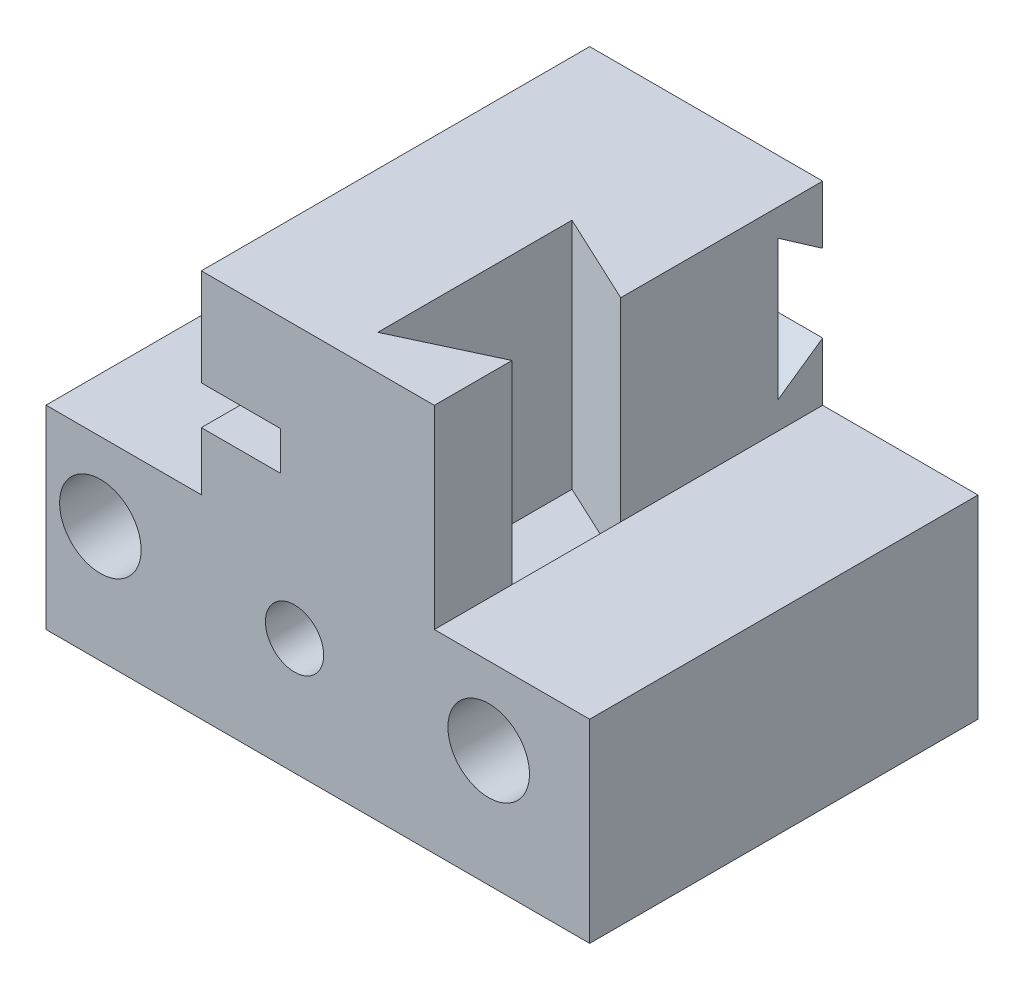
ISO-10303-21;
HEADER;
FILE_DESCRIPTION(('STEP AP214'),'2;1');
FILE_NAME('part.step','',(''),(''),'','','');
FILE_SCHEMA(('AUTOMOTIVE_DESIGN { 1 0 10303 214 1 1 1 1 }'));
ENDSEC;
DATA;
#1=APPLICATION_CONTEXT('core data for automotive mechanical design processes');
#2=APPLICATION_PROTOCOL_DEFINITION('international standard','automotive_design',2000,#1);
#3=PRODUCT_CONTEXT('',#1,'mechanical');
#4=PRODUCT('Part','Part','',(#3));
#5=PRODUCT_RELATED_PRODUCT_CATEGORY('part','',(#4));
#6=PRODUCT_DEFINITION_FORMATION('','',#4);
#7=PRODUCT_DEFINITION_CONTEXT('part definition',#1,'design');
#8=PRODUCT_DEFINITION('design','',#6,#7);
#9=PRODUCT_DEFINITION_SHAPE('','',#8);
#10=(LENGTH_UNIT() NAMED_UNIT(*) SI_UNIT(.MILLI.,.METRE.));
#11=(NAMED_UNIT(*) PLANE_ANGLE_UNIT() SI_UNIT($,.RADIAN.));
#12=(NAMED_UNIT(*) SI_UNIT($,.STERADIAN.) SOLID_ANGLE_UNIT());
#13=UNCERTAINTY_MEASURE_WITH_UNIT(LENGTH_MEASURE(1.E-05),#10,'distance_accuracy_value','');
#14=(GEOMETRIC_REPRESENTATION_CONTEXT(3) GLOBAL_UNCERTAINTY_ASSIGNED_CONTEXT((#13)) GLOBAL_UNIT_ASSIGNED_CONTEXT((#10,
#11,#12)) REPRESENTATION_CONTEXT('',''));
#15=CARTESIAN_POINT('',(0.,0.,0.));
#16=DIRECTION('',(0.,0.,1.));
#17=DIRECTION('',(1.,0.,0.));
#18=AXIS2_PLACEMENT_3D('',#15,#16,#17);
#19=CARTESIAN_POINT('',(2.,0.,0.));
#20=DIRECTION('',(1.,0.,0.));
#21=DIRECTION('',(0.,0.,-1.));
#22=AXIS2_PLACEMENT_3D('',#19,#20,#21);
#23=PLANE('',#22);
#24=DIRECTION('',(0.,1.,0.));
#25=VECTOR('',#24,1.);
#26=CARTESIAN_POINT('',(2.,4.0020682066455,5.));
#27=LINE('',#26,#25);
#28=CARTESIAN_POINT('',(2.,1.5020682066455,5.));
#29=VERTEX_POINT('',#28);
#30=CARTESIAN_POINT('',(2.,2.25126643414342,5.));
#31=VERTEX_POINT('',#30);
#32=EDGE_CURVE('E203',#29,#31,#27,.T.);
#33=ORIENTED_EDGE('',*,*,#32,.T.);
#34=DIRECTION('',(0.,0.,-1.));
#35=VECTOR('',#34,1.);
#36=CARTESIAN_POINT('',(2.,2.25126643414342,5.));
#37=LINE('',#36,#35);
#38=CARTESIAN_POINT('',(2.,2.25126643414342,0.574456264653803));
#39=VERTEX_POINT('',#38);
#40=EDGE_CURVE('E665',#31,#39,#37,.T.);
#41=ORIENTED_EDGE('',*,*,#40,.T.);
#42=DIRECTION('',(0.,1.,0.));
#43=VECTOR('',#42,1.);
#44=CARTESIAN_POINT('',(2.,1.85051975342205,0.574456264653803));
#45=LINE('',#44,#43);
#46=CARTESIAN_POINT('',(2.,1.85051975342205,0.574456264653803));
#47=VERTEX_POINT('',#46);
#48=EDGE_CURVE('E340',#47,#39,#45,.T.);
#49=ORIENTED_EDGE('',*,*,#48,.F.);
#50=DIRECTION('',(0.,-0.571428571428571,0.82065180664829));
#51=VECTOR('',#50,1.);
#52=CARTESIAN_POINT('',(2.,2.25051975342205,0.));
#53=LINE('',#52,#51);
#54=CARTESIAN_POINT('',(2.,2.25051975342205,0.));
#55=VERTEX_POINT('',#54);
#56=EDGE_CURVE('E400',#55,#47,#53,.T.);
#57=ORIENTED_EDGE('',*,*,#56,.F.);
#58=DIRECTION('',(0.,-1.,0.));
#59=VECTOR('',#58,1.);
#60=CARTESIAN_POINT('',(2.,4.0020682066455,0.));
#61=LINE('',#60,#59);
#62=CARTESIAN_POINT('',(2.,1.5020682066455,0.));
#63=VERTEX_POINT('',#62);
#64=EDGE_CURVE('E207',#55,#63,#61,.T.);
#65=ORIENTED_EDGE('',*,*,#64,.T.);
#66=DIRECTION('',(0.,0.,1.));
#67=VECTOR('',#66,1.);
#68=CARTESIAN_POINT('',(2.,1.5020682066455,5.));
#69=LINE('',#68,#67);
#70=EDGE_CURVE('E217',#63,#29,#69,.T.);
#71=ORIENTED_EDGE('',*,*,#70,.T.);
#72=EDGE_LOOP('',(#33,#41,#49,#57,#65,#71));
#73=FACE_BOUND('',#72,.T.);
#74=ADVANCED_FACE('F35',(#73),#23,.F.);
#75=CARTESIAN_POINT('',(7.,-1.,0.));
#76=DIRECTION('',(0.,0.,-1.));
#77=DIRECTION('',(-1.,0.,0.));
#78=AXIS2_PLACEMENT_3D('',#75,#76,#77);
#79=PLANE('',#78);
#80=DIRECTION('',(-1.,0.,0.));
#81=VECTOR('',#80,1.);
#82=CARTESIAN_POINT('',(7.,3.25051975342205,0.));
#83=LINE('',#82,#81);
#84=CARTESIAN_POINT('',(5.,3.25051975342205,0.));
#85=VERTEX_POINT('',#84);
#86=CARTESIAN_POINT('',(2.,3.25051975342205,0.));
#87=VERTEX_POINT('',#86);
#88=EDGE_CURVE('E335',#85,#87,#83,.T.);
#89=ORIENTED_EDGE('',*,*,#88,.T.);
#90=CARTESIAN_POINT('',(2.,4.,0.));
#91=VERTEX_POINT('',#90);
#92=EDGE_CURVE('E214',#91,#87,#61,.T.);
#93=ORIENTED_EDGE('',*,*,#92,.F.);
#94=DIRECTION('',(-1.,0.,0.));
#95=VECTOR('',#94,1.);
#96=CARTESIAN_POINT('',(7.,4.,0.));
#97=LINE('',#96,#95);
#98=CARTESIAN_POINT('',(5.,4.,0.));
#99=VERTEX_POINT('',#98);
#100=EDGE_CURVE('E280',#99,#91,#97,.T.);
#101=ORIENTED_EDGE('',*,*,#100,.F.);
#102=DIRECTION('',(0.,1.,0.));
#103=VECTOR('',#102,1.);
#104=CARTESIAN_POINT('',(5.,4.,0.));
#105=LINE('',#104,#103);
#106=EDGE_CURVE('E241',#85,#99,#105,.T.);
#107=ORIENTED_EDGE('',*,*,#106,.F.);
#108=EDGE_LOOP('',(#89,#93,#101,#107));
#109=FACE_BOUND('',#108,.T.);
#110=ADVANCED_FACE('F333',(#109),#79,.T.);
#111=CARTESIAN_POINT('',(5.,0.,0.));
#112=DIRECTION('',(1.,0.,0.));
#113=DIRECTION('',(0.,0.,-1.));
#114=AXIS2_PLACEMENT_3D('',#111,#112,#113);
#115=PLANE('',#114);
#116=DIRECTION('',(0.,-1.,0.));
#117=VECTOR('',#116,1.);
#118=CARTESIAN_POINT('',(5.,0.,4.));
#119=LINE('',#118,#117);
#120=CARTESIAN_POINT('',(5.,4.,4.));
#121=VERTEX_POINT('',#120);
#122=CARTESIAN_POINT('',(5.,1.5,4.));
#123=VERTEX_POINT('',#122);
#124=EDGE_CURVE('E11',#121,#123,#119,.T.);
#125=ORIENTED_EDGE('',*,*,#124,.F.);
#126=DIRECTION('',(0.,0.,1.));
#127=VECTOR('',#126,1.);
#128=CARTESIAN_POINT('',(5.,4.,5.));
#129=LINE('',#128,#127);
#130=CARTESIAN_POINT('',(5.,4.,5.));
#131=VERTEX_POINT('',#130);
#132=EDGE_CURVE('E246',#121,#131,#129,.T.);
#133=ORIENTED_EDGE('',*,*,#132,.T.);
#134=DIRECTION('',(0.,-1.,0.));
#135=VECTOR('',#134,1.);
#136=CARTESIAN_POINT('',(5.,4.,5.));
#137=LINE('',#136,#135);
#138=CARTESIAN_POINT('',(5.,1.5,5.));
#139=VERTEX_POINT('',#138);
#140=EDGE_CURVE('E234',#131,#139,#137,.T.);
#141=ORIENTED_EDGE('',*,*,#140,.T.);
#142=DIRECTION('',(0.,0.,-1.));
#143=VECTOR('',#142,1.);
#144=CARTESIAN_POINT('',(5.,1.5,5.));
#145=LINE('',#144,#143);
#146=EDGE_CURVE('E238',#139,#123,#145,.T.);
#147=ORIENTED_EDGE('',*,*,#146,.T.);
#148=EDGE_LOOP('',(#125,#133,#141,#147));
#149=FACE_BOUND('',#148,.T.);
#150=ADVANCED_FACE('F417',(#149),#115,.T.);
#151=CARTESIAN_POINT('',(0.,4.,0.));
#152=DIRECTION('',(0.,1.,0.));
#153=DIRECTION('',(0.,0.,1.));
#154=AXIS2_PLACEMENT_3D('',#151,#152,#153);
#155=PLANE('',#154);
#156=DIRECTION('',(0.906093768414596,0.,-0.423076923076923));
#157=VECTOR('',#156,1.);
#158=CARTESIAN_POINT('',(3.82207810106103,4.,4.55));
#159=LINE('',#158,#157);
#160=CARTESIAN_POINT('',(3.82207810106103,4.,4.55));
#161=VERTEX_POINT('',#160);
#162=EDGE_CURVE('E361',#161,#121,#159,.T.);
#163=ORIENTED_EDGE('',*,*,#162,.F.);
#164=DIRECTION('',(0.,0.,1.));
#165=VECTOR('',#164,1.);
#166=CARTESIAN_POINT('',(3.82207810106103,4.,2.05));
#167=LINE('',#166,#165);
#168=CARTESIAN_POINT('',(3.82207810106103,4.,2.05));
#169=VERTEX_POINT('',#168);
#170=EDGE_CURVE('E324',#169,#161,#167,.T.);
#171=ORIENTED_EDGE('',*,*,#170,.F.);
#172=DIRECTION('',(-0.906093768414596,0.,-0.423076923076923));
#173=VECTOR('',#172,1.);
#174=CARTESIAN_POINT('',(5.,4.,2.6));
#175=LINE('',#174,#173);
#176=CARTESIAN_POINT('',(5.,4.,2.6));
#177=VERTEX_POINT('',#176);
#178=EDGE_CURVE('E312',#177,#169,#175,.T.);
#179=ORIENTED_EDGE('',*,*,#178,.F.);
#180=EDGE_CURVE('E247',#99,#177,#129,.T.);
#181=ORIENTED_EDGE('',*,*,#180,.F.);
#182=ORIENTED_EDGE('',*,*,#100,.T.);
#183=DIRECTION('',(0.,0.,-1.));
#184=VECTOR('',#183,1.);
#185=CARTESIAN_POINT('',(2.,4.,0.));
#186=LINE('',#185,#184);
#187=CARTESIAN_POINT('',(2.,4.,5.));
#188=VERTEX_POINT('',#187);
#189=EDGE_CURVE('E224',#188,#91,#186,.T.);
#190=ORIENTED_EDGE('',*,*,#189,.F.);
#191=DIRECTION('',(1.,0.,0.));
#192=VECTOR('',#191,1.);
#193=CARTESIAN_POINT('',(0.,4.,5.));
#194=LINE('',#193,#192);
#195=EDGE_CURVE('E202',#188,#131,#194,.T.);
#196=ORIENTED_EDGE('',*,*,#195,.T.);
#197=ORIENTED_EDGE('',*,*,#132,.F.);
#198=EDGE_LOOP('',(#163,#171,#179,#181,#182,#190,#196,#197));
#199=FACE_BOUND('',#198,.T.);
#200=ADVANCED_FACE('F321',(#199),#155,.T.);
#201=DIRECTION('',(-1.,0.,0.));
#202=VECTOR('',#201,1.);
#203=CARTESIAN_POINT('',(7.,2.25051975342205,0.));
#204=LINE('',#203,#202);
#205=CARTESIAN_POINT('',(5.,2.25051975342205,0.));
#206=VERTEX_POINT('',#205);
#207=EDGE_CURVE('E58',#206,#55,#204,.T.);
#208=ORIENTED_EDGE('',*,*,#207,.F.);
#209=CARTESIAN_POINT('',(5.,1.5,0.));
#210=VERTEX_POINT('',#209);
#211=EDGE_CURVE('E243',#210,#206,#105,.T.);
#212=ORIENTED_EDGE('',*,*,#211,.F.);
#213=DIRECTION('',(1.,0.,0.));
#214=VECTOR('',#213,1.);
#215=CARTESIAN_POINT('',(5.,1.5,0.));
#216=LINE('',#215,#214);
#217=CARTESIAN_POINT('',(7.,1.5,0.));
#218=VERTEX_POINT('',#217);
#219=EDGE_CURVE('E252',#210,#218,#216,.T.);
#220=ORIENTED_EDGE('',*,*,#219,.T.);
#221=DIRECTION('',(0.,1.,0.));
#222=VECTOR('',#221,1.);
#223=CARTESIAN_POINT('',(7.,-1.,0.));
#224=LINE('',#223,#222);
#225=CARTESIAN_POINT('',(7.,-1.,0.));
#226=VERTEX_POINT('',#225);
#227=EDGE_CURVE('E297',#226,#218,#224,.T.);
#228=ORIENTED_EDGE('',*,*,#227,.F.);
#229=DIRECTION('',(-1.,0.,0.));
#230=VECTOR('',#229,1.);
#231=CARTESIAN_POINT('',(7.,-1.,0.));
#232=LINE('',#231,#230);
#233=CARTESIAN_POINT('',(0.,-1.,0.));
#234=VERTEX_POINT('',#233);
#235=EDGE_CURVE('E281',#226,#234,#232,.T.);
#236=ORIENTED_EDGE('',*,*,#235,.T.);
#237=DIRECTION('',(0.,1.,0.));
#238=VECTOR('',#237,1.);
#239=CARTESIAN_POINT('',(0.,-1.,0.));
#240=LINE('',#239,#238);
#241=CARTESIAN_POINT('',(0.,1.5020682066455,0.));
#242=VERTEX_POINT('',#241);
#243=EDGE_CURVE('E293',#234,#242,#240,.T.);
#244=ORIENTED_EDGE('',*,*,#243,.T.);
#245=DIRECTION('',(-1.,0.,0.));
#246=VECTOR('',#245,1.);
#247=CARTESIAN_POINT('',(2.,1.5020682066455,0.));
#248=LINE('',#247,#246);
#249=EDGE_CURVE('E219',#63,#242,#248,.T.);
#250=ORIENTED_EDGE('',*,*,#249,.F.);
#251=ORIENTED_EDGE('',*,*,#64,.F.);
#252=EDGE_LOOP('',(#208,#212,#220,#228,#236,#244,#250,#251));
#253=FACE_BOUND('',#252,.T.);
#254=CARTESIAN_POINT('',(3.2,0.5,0.));
#255=DIRECTION('',(0.,0.,-1.));
#256=DIRECTION('',(-1.,0.,0.));
#257=AXIS2_PLACEMENT_3D('',#254,#255,#256);
#258=CIRCLE('',#257,0.374999999999999);
#259=CARTESIAN_POINT('',(2.825,0.5,0.));
#260=VERTEX_POINT('',#259);
#261=EDGE_CURVE('E227',#260,#260,#258,.T.);
#262=ORIENTED_EDGE('',*,*,#261,.F.);
#263=EDGE_LOOP('',(#262));
#264=FACE_BOUND('',#263,.T.);
#265=CARTESIAN_POINT('',(5.7,0.499999999999999,0.));
#266=DIRECTION('',(0.,0.,-1.));
#267=DIRECTION('',(-1.,0.,0.));
#268=AXIS2_PLACEMENT_3D('',#265,#266,#267);
#269=CIRCLE('',#268,0.650000000000015);
#270=CARTESIAN_POINT('',(5.04999999999998,0.499999999999999,0.));
#271=VERTEX_POINT('',#270);
#272=EDGE_CURVE('E255',#271,#271,#269,.T.);
#273=ORIENTED_EDGE('',*,*,#272,.F.);
#274=EDGE_LOOP('',(#273));
#275=FACE_BOUND('',#274,.T.);
#276=CARTESIAN_POINT('',(0.7,0.5,0.));
#277=DIRECTION('',(0.,0.,-1.));
#278=DIRECTION('',(-1.,0.,0.));
#279=AXIS2_PLACEMENT_3D('',#276,#277,#278);
#280=CIRCLE('',#279,0.650000000000015);
#281=CARTESIAN_POINT('',(0.0499999999999852,0.5,0.));
#282=VERTEX_POINT('',#281);
#283=EDGE_CURVE('E268',#282,#282,#280,.T.);
#284=ORIENTED_EDGE('',*,*,#283,.F.);
#285=EDGE_LOOP('',(#284));
#286=FACE_BOUND('',#285,.T.);
#287=ADVANCED_FACE('F37',(#253,#264,#275,#286),#79,.T.);
#288=CARTESIAN_POINT('',(7.,-1.,5.));
#289=DIRECTION('',(1.,0.,0.));
#290=DIRECTION('',(0.,0.,-1.));
#291=AXIS2_PLACEMENT_3D('',#288,#289,#290);
#292=PLANE('',#291);
#293=DIRECTION('',(0.,0.,-1.));
#294=VECTOR('',#293,1.);
#295=CARTESIAN_POINT('',(7.,1.5,5.));
#296=LINE('',#295,#294);
#297=CARTESIAN_POINT('',(7.,1.5,5.));
#298=VERTEX_POINT('',#297);
#299=EDGE_CURVE('E233',#298,#218,#296,.T.);
#300=ORIENTED_EDGE('',*,*,#299,.F.);
#301=DIRECTION('',(0.,1.,0.));
#302=VECTOR('',#301,1.);
#303=CARTESIAN_POINT('',(7.,-1.,5.));
#304=LINE('',#303,#302);
#305=CARTESIAN_POINT('',(7.,-1.,5.));
#306=VERTEX_POINT('',#305);
#307=EDGE_CURVE('E300',#306,#298,#304,.T.);
#308=ORIENTED_EDGE('',*,*,#307,.F.);
#309=DIRECTION('',(0.,0.,-1.));
#310=VECTOR('',#309,1.);
#311=CARTESIAN_POINT('',(7.,-1.,5.));
#312=LINE('',#311,#310);
#313=EDGE_CURVE('E290',#306,#226,#312,.T.);
#314=ORIENTED_EDGE('',*,*,#313,.T.);
#315=ORIENTED_EDGE('',*,*,#227,.T.);
#316=EDGE_LOOP('',(#300,#308,#314,#315));
#317=FACE_BOUND('',#316,.T.);
#318=ADVANCED_FACE('F413',(#317),#292,.T.);
#319=CARTESIAN_POINT('',(0.,-1.,5.));
#320=DIRECTION('',(0.,0.,1.));
#321=DIRECTION('',(1.,0.,0.));
#322=AXIS2_PLACEMENT_3D('',#319,#320,#321);
#323=PLANE('',#322);
#324=DIRECTION('',(-1.,0.,0.));
#325=VECTOR('',#324,1.);
#326=CARTESIAN_POINT('',(2.,2.25126643414342,5.));
#327=LINE('',#326,#325);
#328=CARTESIAN_POINT('',(3.02036879201495,2.25126643414342,5.));
#329=VERTEX_POINT('',#328);
#330=EDGE_CURVE('E194',#329,#31,#327,.T.);
#331=ORIENTED_EDGE('',*,*,#330,.T.);
#332=ORIENTED_EDGE('',*,*,#32,.F.);
#333=DIRECTION('',(-1.,0.,0.));
#334=VECTOR('',#333,1.);
#335=CARTESIAN_POINT('',(2.,1.5020682066455,5.));
#336=LINE('',#335,#334);
#337=CARTESIAN_POINT('',(0.,1.5020682066455,5.));
#338=VERTEX_POINT('',#337);
#339=EDGE_CURVE('E221',#29,#338,#336,.T.);
#340=ORIENTED_EDGE('',*,*,#339,.T.);
#341=DIRECTION('',(0.,1.,0.));
#342=VECTOR('',#341,1.);
#343=CARTESIAN_POINT('',(0.,-1.,5.));
#344=LINE('',#343,#342);
#345=CARTESIAN_POINT('',(0.,-1.,5.));
#346=VERTEX_POINT('',#345);
#347=EDGE_CURVE('E303',#346,#338,#344,.T.);
#348=ORIENTED_EDGE('',*,*,#347,.F.);
#349=DIRECTION('',(1.,0.,0.));
#350=VECTOR('',#349,1.);
#351=CARTESIAN_POINT('',(0.,-1.,5.));
#352=LINE('',#351,#350);
#353=EDGE_CURVE('E287',#346,#306,#352,.T.);
#354=ORIENTED_EDGE('',*,*,#353,.T.);
#355=ORIENTED_EDGE('',*,*,#307,.T.);
#356=DIRECTION('',(1.,0.,0.));
#357=VECTOR('',#356,1.);
#358=CARTESIAN_POINT('',(5.,1.5,5.));
#359=LINE('',#358,#357);
#360=EDGE_CURVE('E250',#139,#298,#359,.T.);
#361=ORIENTED_EDGE('',*,*,#360,.F.);
#362=ORIENTED_EDGE('',*,*,#140,.F.);
#363=ORIENTED_EDGE('',*,*,#195,.F.);
#364=CARTESIAN_POINT('',(2.,2.75051975342205,5.));
#365=VERTEX_POINT('',#364);
#366=EDGE_CURVE('E190',#365,#188,#27,.T.);
#367=ORIENTED_EDGE('',*,*,#366,.F.);
#368=DIRECTION('',(1.,0.,0.));
#369=VECTOR('',#368,1.);
#370=CARTESIAN_POINT('',(2.,2.75051975342205,5.));
#371=LINE('',#370,#369);
#372=CARTESIAN_POINT('',(3.02036879201495,2.75051975342205,5.));
#373=VERTEX_POINT('',#372);
#374=EDGE_CURVE('E177',#365,#373,#371,.T.);
#375=ORIENTED_EDGE('',*,*,#374,.T.);
#376=DIRECTION('',(0.,-1.,0.));
#377=VECTOR('',#376,1.);
#378=CARTESIAN_POINT('',(3.02036879201495,2.25126643414342,5.));
#379=LINE('',#378,#377);
#380=EDGE_CURVE('E184',#373,#329,#379,.T.);
#381=ORIENTED_EDGE('',*,*,#380,.T.);
#382=EDGE_LOOP('',(#331,#332,#340,#348,#354,#355,#361,#362,#363,#367,#375,#381));
#383=FACE_BOUND('',#382,.T.);
#384=CARTESIAN_POINT('',(3.2,0.5,5.));
#385=DIRECTION('',(0.,0.,1.));
#386=DIRECTION('',(1.,0.,0.));
#387=AXIS2_PLACEMENT_3D('',#384,#385,#386);
#388=CIRCLE('',#387,0.374999999999999);
#389=CARTESIAN_POINT('',(3.575,0.5,5.));
#390=VERTEX_POINT('',#389);
#391=EDGE_CURVE('E230',#390,#390,#388,.T.);
#392=ORIENTED_EDGE('',*,*,#391,.F.);
#393=EDGE_LOOP('',(#392));
#394=FACE_BOUND('',#393,.T.);
#395=CARTESIAN_POINT('',(5.7,0.499999999999999,5.));
#396=DIRECTION('',(0.,0.,-1.));
#397=DIRECTION('',(-1.,0.,0.));
#398=AXIS2_PLACEMENT_3D('',#395,#396,#397);
#399=CIRCLE('',#398,0.525000000000013);
#400=CARTESIAN_POINT('',(5.17499999999999,0.499999999999999,5.));
#401=VERTEX_POINT('',#400);
#402=EDGE_CURVE('E265',#401,#401,#399,.T.);
#403=ORIENTED_EDGE('',*,*,#402,.T.);
#404=EDGE_LOOP('',(#403));
#405=FACE_BOUND('',#404,.T.);
#406=CARTESIAN_POINT('',(0.7,0.5,5.));
#407=DIRECTION('',(0.,0.,-1.));
#408=DIRECTION('',(-1.,0.,0.));
#409=AXIS2_PLACEMENT_3D('',#406,#407,#408);
#410=CIRCLE('',#409,0.525000000000013);
#411=CARTESIAN_POINT('',(0.174999999999987,0.5,5.));
#412=VERTEX_POINT('',#411);
#413=EDGE_CURVE('E277',#412,#412,#410,.T.);
#414=ORIENTED_EDGE('',*,*,#413,.T.);
#415=EDGE_LOOP('',(#414));
#416=FACE_BOUND('',#415,.T.);
#417=ADVANCED_FACE('F198',(#383,#394,#405,#416),#323,.T.);
#418=CARTESIAN_POINT('',(0.,-1.,0.));
#419=DIRECTION('',(-1.,0.,0.));
#420=DIRECTION('',(0.,0.,1.));
#421=AXIS2_PLACEMENT_3D('',#418,#419,#420);
#422=PLANE('',#421);
#423=DIRECTION('',(0.,0.,1.));
#424=VECTOR('',#423,1.);
#425=CARTESIAN_POINT('',(0.,1.5020682066455,5.));
#426=LINE('',#425,#424);
#427=EDGE_CURVE('E204',#242,#338,#426,.T.);
#428=ORIENTED_EDGE('',*,*,#427,.F.);
#429=ORIENTED_EDGE('',*,*,#243,.F.);
#430=DIRECTION('',(0.,0.,1.));
#431=VECTOR('',#430,1.);
#432=CARTESIAN_POINT('',(0.,-1.,0.));
#433=LINE('',#432,#431);
#434=EDGE_CURVE('E284',#234,#346,#433,.T.);
#435=ORIENTED_EDGE('',*,*,#434,.T.);
#436=ORIENTED_EDGE('',*,*,#347,.T.);
#437=EDGE_LOOP('',(#428,#429,#435,#436));
#438=FACE_BOUND('',#437,.T.);
#439=ADVANCED_FACE('F406',(#438),#422,.T.);
#440=CARTESIAN_POINT('',(0.,-1.,0.));
#441=DIRECTION('',(0.,1.,0.));
#442=DIRECTION('',(0.,0.,1.));
#443=AXIS2_PLACEMENT_3D('',#440,#441,#442);
#444=PLANE('',#443);
#445=ORIENTED_EDGE('',*,*,#235,.F.);
#446=ORIENTED_EDGE('',*,*,#313,.F.);
#447=ORIENTED_EDGE('',*,*,#353,.F.);
#448=ORIENTED_EDGE('',*,*,#434,.F.);
#449=EDGE_LOOP('',(#445,#446,#447,#448));
#450=FACE_BOUND('',#449,.T.);
#451=ADVANCED_FACE('F410',(#450),#444,.F.);
#452=CARTESIAN_POINT('',(0.7,0.5,0.));
#453=DIRECTION('',(0.,0.,-1.));
#454=DIRECTION('',(-1.,0.,0.));
#455=AXIS2_PLACEMENT_3D('',#452,#453,#454);
#456=CYLINDRICAL_SURFACE('',#455,0.525000000000013);
#457=ORIENTED_EDGE('',*,*,#413,.F.);
#458=EDGE_LOOP('',(#457));
#459=FACE_BOUND('',#458,.T.);
#460=CARTESIAN_POINT('',(0.7,0.5,1.2));
#461=DIRECTION('',(0.,0.,-1.));
#462=DIRECTION('',(-1.,0.,0.));
#463=AXIS2_PLACEMENT_3D('',#460,#461,#462);
#464=CIRCLE('',#463,0.525000000000013);
#465=CARTESIAN_POINT('',(0.174999999999987,0.5,1.2));
#466=VERTEX_POINT('',#465);
#467=EDGE_CURVE('E274',#466,#466,#464,.T.);
#468=ORIENTED_EDGE('',*,*,#467,.T.);
#469=EDGE_LOOP('',(#468));
#470=FACE_BOUND('',#469,.T.);
#471=ADVANCED_FACE('F469',(#459,#470),#456,.F.);
#472=CARTESIAN_POINT('',(1.22500000000001,0.5,1.2));
#473=DIRECTION('',(0.,0.,1.));
#474=DIRECTION('',(1.,0.,0.));
#475=AXIS2_PLACEMENT_3D('',#472,#473,#474);
#476=PLANE('',#475);
#477=ORIENTED_EDGE('',*,*,#467,.F.);
#478=EDGE_LOOP('',(#477));
#479=FACE_BOUND('',#478,.T.);
#480=CARTESIAN_POINT('',(0.7,0.5,1.2));
#481=DIRECTION('',(0.,0.,-1.));
#482=DIRECTION('',(-1.,0.,0.));
#483=AXIS2_PLACEMENT_3D('',#480,#481,#482);
#484=CIRCLE('',#483,0.650000000000015);
#485=CARTESIAN_POINT('',(0.0499999999999852,0.5,1.2));
#486=VERTEX_POINT('',#485);
#487=EDGE_CURVE('E271',#486,#486,#484,.T.);
#488=ORIENTED_EDGE('',*,*,#487,.T.);
#489=EDGE_LOOP('',(#488));
#490=FACE_BOUND('',#489,.T.);
#491=ADVANCED_FACE('F465',(#479,#490),#476,.F.);
#492=CARTESIAN_POINT('',(0.7,0.5,0.));
#493=DIRECTION('',(0.,0.,-1.));
#494=DIRECTION('',(-1.,0.,0.));
#495=AXIS2_PLACEMENT_3D('',#492,#493,#494);
#496=CYLINDRICAL_SURFACE('',#495,0.650000000000015);
#497=ORIENTED_EDGE('',*,*,#487,.F.);
#498=EDGE_LOOP('',(#497));
#499=FACE_BOUND('',#498,.T.);
#500=ORIENTED_EDGE('',*,*,#283,.T.);
#501=EDGE_LOOP('',(#500));
#502=FACE_BOUND('',#501,.T.);
#503=ADVANCED_FACE('F461',(#499,#502),#496,.F.);
#504=CARTESIAN_POINT('',(5.7,0.499999999999999,0.));
#505=DIRECTION('',(0.,0.,-1.));
#506=DIRECTION('',(-1.,0.,0.));
#507=AXIS2_PLACEMENT_3D('',#504,#505,#506);
#508=CYLINDRICAL_SURFACE('',#507,0.525000000000013);
#509=ORIENTED_EDGE('',*,*,#402,.F.);
#510=EDGE_LOOP('',(#509));
#511=FACE_BOUND('',#510,.T.);
#512=CARTESIAN_POINT('',(5.7,0.499999999999999,1.2));
#513=DIRECTION('',(0.,0.,-1.));
#514=DIRECTION('',(-1.,0.,0.));
#515=AXIS2_PLACEMENT_3D('',#512,#513,#514);
#516=CIRCLE('',#515,0.525000000000013);
#517=CARTESIAN_POINT('',(5.17499999999999,0.499999999999999,1.2));
#518=VERTEX_POINT('',#517);
#519=EDGE_CURVE('E262',#518,#518,#516,.T.);
#520=ORIENTED_EDGE('',*,*,#519,.T.);
#521=EDGE_LOOP('',(#520));
#522=FACE_BOUND('',#521,.T.);
#523=ADVANCED_FACE('F457',(#511,#522),#508,.F.);
#524=CARTESIAN_POINT('',(6.22500000000001,0.499999999999999,1.2));
#525=DIRECTION('',(0.,0.,1.));
#526=DIRECTION('',(1.,0.,0.));
#527=AXIS2_PLACEMENT_3D('',#524,#525,#526);
#528=PLANE('',#527);
#529=ORIENTED_EDGE('',*,*,#519,.F.);
#530=EDGE_LOOP('',(#529));
#531=FACE_BOUND('',#530,.T.);
#532=CARTESIAN_POINT('',(5.7,0.499999999999999,1.2));
#533=DIRECTION('',(0.,0.,-1.));
#534=DIRECTION('',(-1.,0.,0.));
#535=AXIS2_PLACEMENT_3D('',#532,#533,#534);
#536=CIRCLE('',#535,0.650000000000015);
#537=CARTESIAN_POINT('',(5.04999999999998,0.499999999999999,1.2));
#538=VERTEX_POINT('',#537);
#539=EDGE_CURVE('E259',#538,#538,#536,.T.);
#540=ORIENTED_EDGE('',*,*,#539,.T.);
#541=EDGE_LOOP('',(#540));
#542=FACE_BOUND('',#541,.T.);
#543=ADVANCED_FACE('F453',(#531,#542),#528,.F.);
#544=CARTESIAN_POINT('',(5.7,0.499999999999999,0.));
#545=DIRECTION('',(0.,0.,-1.));
#546=DIRECTION('',(-1.,0.,0.));
#547=AXIS2_PLACEMENT_3D('',#544,#545,#546);
#548=CYLINDRICAL_SURFACE('',#547,0.650000000000015);
#549=ORIENTED_EDGE('',*,*,#539,.F.);
#550=EDGE_LOOP('',(#549));
#551=FACE_BOUND('',#550,.T.);
#552=ORIENTED_EDGE('',*,*,#272,.T.);
#553=EDGE_LOOP('',(#552));
#554=FACE_BOUND('',#553,.T.);
#555=ADVANCED_FACE('F450',(#551,#554),#548,.F.);
#556=CARTESIAN_POINT('',(5.,1.5,5.));
#557=DIRECTION('',(0.,-1.,0.));
#558=DIRECTION('',(0.,0.,-1.));
#559=AXIS2_PLACEMENT_3D('',#556,#557,#558);
#560=PLANE('',#559);
#561=ORIENTED_EDGE('',*,*,#299,.T.);
#562=ORIENTED_EDGE('',*,*,#219,.F.);
#563=CARTESIAN_POINT('',(5.,1.5,2.6));
#564=VERTEX_POINT('',#563);
#565=EDGE_CURVE('E237',#564,#210,#145,.T.);
#566=ORIENTED_EDGE('',*,*,#565,.F.);
#567=EDGE_CURVE('E242',#123,#564,#145,.T.);
#568=ORIENTED_EDGE('',*,*,#567,.F.);
#569=ORIENTED_EDGE('',*,*,#146,.F.);
#570=ORIENTED_EDGE('',*,*,#360,.T.);
#571=EDGE_LOOP('',(#561,#562,#566,#568,#569,#570));
#572=FACE_BOUND('',#571,.T.);
#573=ADVANCED_FACE('F390',(#572),#560,.F.);
#574=DIRECTION('',(0.,0.571428571428572,0.82065180664829));
#575=VECTOR('',#574,1.);
#576=CARTESIAN_POINT('',(5.,2.18912554822302,-1.52431137610958));
#577=LINE('',#576,#575);
#578=CARTESIAN_POINT('',(5.,3.65051975342205,0.574456264653803));
#579=VERTEX_POINT('',#578);
#580=EDGE_CURVE('E325',#85,#579,#577,.T.);
#581=ORIENTED_EDGE('',*,*,#580,.F.);
#582=ORIENTED_EDGE('',*,*,#106,.T.);
#583=ORIENTED_EDGE('',*,*,#180,.T.);
#584=DIRECTION('',(0.,1.,0.));
#585=VECTOR('',#584,1.);
#586=CARTESIAN_POINT('',(5.,0.,2.6));
#587=LINE('',#586,#585);
#588=EDGE_CURVE('E43',#564,#177,#587,.T.);
#589=ORIENTED_EDGE('',*,*,#588,.F.);
#590=ORIENTED_EDGE('',*,*,#565,.T.);
#591=ORIENTED_EDGE('',*,*,#211,.T.);
#592=DIRECTION('',(0.,0.571428571428571,-0.82065180664829));
#593=VECTOR('',#592,1.);
#594=CARTESIAN_POINT('',(5.,1.51565616046791,1.05536748659627));
#595=LINE('',#594,#593);
#596=CARTESIAN_POINT('',(5.,1.85051975342205,0.574456264653803));
#597=VERTEX_POINT('',#596);
#598=EDGE_CURVE('E349',#597,#206,#595,.T.);
#599=ORIENTED_EDGE('',*,*,#598,.F.);
#600=DIRECTION('',(0.,-1.,0.));
#601=VECTOR('',#600,1.);
#602=CARTESIAN_POINT('',(5.,0.,0.574456264653803));
#603=LINE('',#602,#601);
#604=EDGE_CURVE('E354',#579,#597,#603,.T.);
#605=ORIENTED_EDGE('',*,*,#604,.F.);
#606=EDGE_LOOP('',(#581,#582,#583,#589,#590,#591,#599,#605));
#607=FACE_BOUND('',#606,.T.);
#608=ADVANCED_FACE('F328',(#607),#115,.T.);
#609=CARTESIAN_POINT('',(3.2,0.5,0.));
#610=DIRECTION('',(0.,0.,-1.));
#611=DIRECTION('',(-1.,0.,0.));
#612=AXIS2_PLACEMENT_3D('',#609,#610,#611);
#613=CYLINDRICAL_SURFACE('',#612,0.374999999999999);
#614=ORIENTED_EDGE('',*,*,#261,.T.);
#615=EDGE_LOOP('',(#614));
#616=FACE_BOUND('',#615,.T.);
#617=ORIENTED_EDGE('',*,*,#391,.T.);
#618=EDGE_LOOP('',(#617));
#619=FACE_BOUND('',#618,.T.);
#620=ADVANCED_FACE('F439',(#616,#619),#613,.F.);
#621=CARTESIAN_POINT('',(2.,1.5020682066455,5.));
#622=DIRECTION('',(0.,-1.,0.));
#623=DIRECTION('',(0.,0.,-1.));
#624=AXIS2_PLACEMENT_3D('',#621,#622,#623);
#625=PLANE('',#624);
#626=ORIENTED_EDGE('',*,*,#427,.T.);
#627=ORIENTED_EDGE('',*,*,#339,.F.);
#628=ORIENTED_EDGE('',*,*,#70,.F.);
#629=ORIENTED_EDGE('',*,*,#249,.T.);
#630=EDGE_LOOP('',(#626,#627,#628,#629));
#631=FACE_BOUND('',#630,.T.);
#632=ADVANCED_FACE('F402',(#631),#625,.F.);
#633=CARTESIAN_POINT('',(2.,2.75051975342205,0.574456264653803));
#634=VERTEX_POINT('',#633);
#635=CARTESIAN_POINT('',(2.,3.65051975342205,0.574456264653803));
#636=VERTEX_POINT('',#635);
#637=EDGE_CURVE('E193',#634,#636,#45,.T.);
#638=ORIENTED_EDGE('',*,*,#637,.F.);
#639=DIRECTION('',(0.,0.,-1.));
#640=VECTOR('',#639,1.);
#641=CARTESIAN_POINT('',(2.,2.75051975342205,5.));
#642=LINE('',#641,#640);
#643=EDGE_CURVE('E50',#365,#634,#642,.T.);
#644=ORIENTED_EDGE('',*,*,#643,.F.);
#645=ORIENTED_EDGE('',*,*,#366,.T.);
#646=ORIENTED_EDGE('',*,*,#189,.T.);
#647=ORIENTED_EDGE('',*,*,#92,.T.);
#648=DIRECTION('',(0.,-0.571428571428572,-0.82065180664829));
#649=VECTOR('',#648,1.);
#650=CARTESIAN_POINT('',(2.,3.65051975342205,0.574456264653803));
#651=LINE('',#650,#649);
#652=EDGE_CURVE('E337',#636,#87,#651,.T.);
#653=ORIENTED_EDGE('',*,*,#652,.F.);
#654=EDGE_LOOP('',(#638,#644,#645,#646,#647,#653));
#655=FACE_BOUND('',#654,.T.);
#656=ADVANCED_FACE('F189',(#655),#23,.F.);
#657=CARTESIAN_POINT('',(5.,1.,4.));
#658=DIRECTION('',(1.,0.,0.));
#659=DIRECTION('',(0.,0.,-1.));
#660=AXIS2_PLACEMENT_3D('',#657,#658,#659);
#661=PLANE('',#660);
#662=DIRECTION('',(0.,1.,0.));
#663=VECTOR('',#662,1.);
#664=CARTESIAN_POINT('',(5.,1.,2.6));
#665=LINE('',#664,#663);
#666=CARTESIAN_POINT('',(5.,1.,2.6));
#667=VERTEX_POINT('',#666);
#668=EDGE_CURVE('E212',#667,#564,#665,.T.);
#669=ORIENTED_EDGE('',*,*,#668,.F.);
#670=DIRECTION('',(0.,0.,-1.));
#671=VECTOR('',#670,1.);
#672=CARTESIAN_POINT('',(5.,1.,4.));
#673=LINE('',#672,#671);
#674=CARTESIAN_POINT('',(5.,1.,4.));
#675=VERTEX_POINT('',#674);
#676=EDGE_CURVE('E357',#675,#667,#673,.T.);
#677=ORIENTED_EDGE('',*,*,#676,.F.);
#678=DIRECTION('',(0.,1.,0.));
#679=VECTOR('',#678,1.);
#680=CARTESIAN_POINT('',(5.,1.,4.));
#681=LINE('',#680,#679);
#682=EDGE_CURVE('E208',#675,#123,#681,.T.);
#683=ORIENTED_EDGE('',*,*,#682,.T.);
#684=ORIENTED_EDGE('',*,*,#567,.T.);
#685=EDGE_LOOP('',(#669,#677,#683,#684));
#686=FACE_BOUND('',#685,.T.);
#687=ADVANCED_FACE('F384',(#686),#661,.F.);
#688=CARTESIAN_POINT('',(3.82207810106103,1.,4.55));
#689=DIRECTION('',(0.423076923076923,0.,0.906093768414596));
#690=DIRECTION('',(0.906093768414596,0.,-0.423076923076923));
#691=AXIS2_PLACEMENT_3D('',#688,#689,#690);
#692=PLANE('',#691);
#693=ORIENTED_EDGE('',*,*,#162,.T.);
#694=ORIENTED_EDGE('',*,*,#124,.T.);
#695=ORIENTED_EDGE('',*,*,#682,.F.);
#696=DIRECTION('',(0.906093768414596,0.,-0.423076923076923));
#697=VECTOR('',#696,1.);
#698=CARTESIAN_POINT('',(3.82207810106103,1.,4.55));
#699=LINE('',#698,#697);
#700=CARTESIAN_POINT('',(3.82207810106103,1.,4.55));
#701=VERTEX_POINT('',#700);
#702=EDGE_CURVE('E367',#701,#675,#699,.T.);
#703=ORIENTED_EDGE('',*,*,#702,.F.);
#704=DIRECTION('',(0.,1.,0.));
#705=VECTOR('',#704,1.);
#706=CARTESIAN_POINT('',(3.82207810106103,1.,4.55));
#707=LINE('',#706,#705);
#708=EDGE_CURVE('E374',#701,#161,#707,.T.);
#709=ORIENTED_EDGE('',*,*,#708,.T.);
#710=EDGE_LOOP('',(#693,#694,#695,#703,#709));
#711=FACE_BOUND('',#710,.T.);
#712=ADVANCED_FACE('F419',(#711),#692,.F.);
#713=CARTESIAN_POINT('',(3.82207810106103,1.,2.05));
#714=DIRECTION('',(-1.,0.,0.));
#715=DIRECTION('',(0.,0.,1.));
#716=AXIS2_PLACEMENT_3D('',#713,#714,#715);
#717=PLANE('',#716);
#718=ORIENTED_EDGE('',*,*,#170,.T.);
#719=ORIENTED_EDGE('',*,*,#708,.F.);
#720=DIRECTION('',(0.,0.,1.));
#721=VECTOR('',#720,1.);
#722=CARTESIAN_POINT('',(3.82207810106103,1.,2.05));
#723=LINE('',#722,#721);
#724=CARTESIAN_POINT('',(3.82207810106103,1.,2.05));
#725=VERTEX_POINT('',#724);
#726=EDGE_CURVE('E364',#725,#701,#723,.T.);
#727=ORIENTED_EDGE('',*,*,#726,.F.);
#728=DIRECTION('',(0.,1.,0.));
#729=VECTOR('',#728,1.);
#730=CARTESIAN_POINT('',(3.82207810106103,1.,2.05));
#731=LINE('',#730,#729);
#732=EDGE_CURVE('E375',#725,#169,#731,.T.);
#733=ORIENTED_EDGE('',*,*,#732,.T.);
#734=EDGE_LOOP('',(#718,#719,#727,#733));
#735=FACE_BOUND('',#734,.T.);
#736=ADVANCED_FACE('F378',(#735),#717,.F.);
#737=CARTESIAN_POINT('',(5.,1.,2.6));
#738=DIRECTION('',(0.423076923076923,0.,-0.906093768414596));
#739=DIRECTION('',(-0.906093768414596,0.,-0.423076923076923));
#740=AXIS2_PLACEMENT_3D('',#737,#738,#739);
#741=PLANE('',#740);
#742=ORIENTED_EDGE('',*,*,#178,.T.);
#743=ORIENTED_EDGE('',*,*,#732,.F.);
#744=DIRECTION('',(-0.906093768414596,0.,-0.423076923076923));
#745=VECTOR('',#744,1.);
#746=CARTESIAN_POINT('',(5.,1.,2.6));
#747=LINE('',#746,#745);
#748=EDGE_CURVE('E360',#667,#725,#747,.T.);
#749=ORIENTED_EDGE('',*,*,#748,.F.);
#750=ORIENTED_EDGE('',*,*,#668,.T.);
#751=ORIENTED_EDGE('',*,*,#588,.T.);
#752=EDGE_LOOP('',(#742,#743,#749,#750,#751));
#753=FACE_BOUND('',#752,.T.);
#754=ADVANCED_FACE('F311',(#753),#741,.F.);
#755=CARTESIAN_POINT('',(0.,1.,0.));
#756=DIRECTION('',(0.,1.,0.));
#757=DIRECTION('',(0.,0.,1.));
#758=AXIS2_PLACEMENT_3D('',#755,#756,#757);
#759=PLANE('',#758);
#760=ORIENTED_EDGE('',*,*,#676,.T.);
#761=ORIENTED_EDGE('',*,*,#748,.T.);
#762=ORIENTED_EDGE('',*,*,#726,.T.);
#763=ORIENTED_EDGE('',*,*,#702,.T.);
#764=EDGE_LOOP('',(#760,#761,#762,#763));
#765=FACE_BOUND('',#764,.T.);
#766=ADVANCED_FACE('F381',(#765),#759,.T.);
#767=CARTESIAN_POINT('',(7.,3.65051975342205,0.574456264653803));
#768=DIRECTION('',(0.,0.82065180664829,-0.571428571428572));
#769=DIRECTION('',(0.,0.571428571428572,0.82065180664829));
#770=AXIS2_PLACEMENT_3D('',#767,#768,#769);
#771=PLANE('',#770);
#772=ORIENTED_EDGE('',*,*,#580,.T.);
#773=DIRECTION('',(-1.,0.,0.));
#774=VECTOR('',#773,1.);
#775=CARTESIAN_POINT('',(7.,3.65051975342205,0.574456264653803));
#776=LINE('',#775,#774);
#777=EDGE_CURVE('E350',#579,#636,#776,.T.);
#778=ORIENTED_EDGE('',*,*,#777,.T.);
#779=ORIENTED_EDGE('',*,*,#652,.T.);
#780=ORIENTED_EDGE('',*,*,#88,.F.);
#781=EDGE_LOOP('',(#772,#778,#779,#780));
#782=FACE_BOUND('',#781,.T.);
#783=ADVANCED_FACE('F578',(#782),#771,.F.);
#784=CARTESIAN_POINT('',(7.,1.85051975342205,0.574456264653803));
#785=DIRECTION('',(0.,0.,1.));
#786=DIRECTION('',(0.,-1.,0.));
#787=AXIS2_PLACEMENT_3D('',#784,#785,#786);
#788=PLANE('',#787);
#789=ORIENTED_EDGE('',*,*,#48,.T.);
#790=DIRECTION('',(-1.,0.,0.));
#791=VECTOR('',#790,1.);
#792=CARTESIAN_POINT('',(2.,2.25126643414342,0.574456264653803));
#793=LINE('',#792,#791);
#794=CARTESIAN_POINT('',(3.02036879201495,2.25126643414342,0.574456264653803));
#795=VERTEX_POINT('',#794);
#796=EDGE_CURVE('E185',#795,#39,#793,.T.);
#797=ORIENTED_EDGE('',*,*,#796,.F.);
#798=DIRECTION('',(0.,-1.,0.));
#799=VECTOR('',#798,1.);
#800=CARTESIAN_POINT('',(3.02036879201495,2.25126643414342,0.574456264653803));
#801=LINE('',#800,#799);
#802=CARTESIAN_POINT('',(3.02036879201495,2.75051975342205,0.574456264653803));
#803=VERTEX_POINT('',#802);
#804=EDGE_CURVE('E673',#803,#795,#801,.T.);
#805=ORIENTED_EDGE('',*,*,#804,.F.);
#806=DIRECTION('',(1.,0.,0.));
#807=VECTOR('',#806,1.);
#808=CARTESIAN_POINT('',(2.,2.75051975342205,0.574456264653803));
#809=LINE('',#808,#807);
#810=EDGE_CURVE('E664',#634,#803,#809,.T.);
#811=ORIENTED_EDGE('',*,*,#810,.F.);
#812=ORIENTED_EDGE('',*,*,#637,.T.);
#813=ORIENTED_EDGE('',*,*,#777,.F.);
#814=ORIENTED_EDGE('',*,*,#604,.T.);
#815=DIRECTION('',(-1.,0.,0.));
#816=VECTOR('',#815,1.);
#817=CARTESIAN_POINT('',(7.,1.85051975342205,0.574456264653803));
#818=LINE('',#817,#816);
#819=EDGE_CURVE('E342',#597,#47,#818,.T.);
#820=ORIENTED_EDGE('',*,*,#819,.T.);
#821=EDGE_LOOP('',(#789,#797,#805,#811,#812,#813,#814,#820));
#822=FACE_BOUND('',#821,.T.);
#823=ADVANCED_FACE('F616',(#822),#788,.F.);
#824=CARTESIAN_POINT('',(7.,2.25051975342205,0.));
#825=DIRECTION('',(0.,-0.82065180664829,-0.571428571428571));
#826=DIRECTION('',(0.,0.571428571428571,-0.82065180664829));
#827=AXIS2_PLACEMENT_3D('',#824,#825,#826);
#828=PLANE('',#827);
#829=ORIENTED_EDGE('',*,*,#598,.T.);
#830=ORIENTED_EDGE('',*,*,#207,.T.);
#831=ORIENTED_EDGE('',*,*,#56,.T.);
#832=ORIENTED_EDGE('',*,*,#819,.F.);
#833=EDGE_LOOP('',(#829,#830,#831,#832));
#834=FACE_BOUND('',#833,.T.);
#835=ADVANCED_FACE('F621',(#834),#828,.F.);
#836=CARTESIAN_POINT('',(2.,2.25126643414342,5.));
#837=DIRECTION('',(0.,-1.,0.));
#838=DIRECTION('',(0.,0.,-1.));
#839=AXIS2_PLACEMENT_3D('',#836,#837,#838);
#840=PLANE('',#839);
#841=ORIENTED_EDGE('',*,*,#796,.T.);
#842=ORIENTED_EDGE('',*,*,#40,.F.);
#843=ORIENTED_EDGE('',*,*,#330,.F.);
#844=DIRECTION('',(0.,0.,-1.));
#845=VECTOR('',#844,1.);
#846=CARTESIAN_POINT('',(3.02036879201495,2.25126643414342,5.));
#847=LINE('',#846,#845);
#848=EDGE_CURVE('E667',#329,#795,#847,.T.);
#849=ORIENTED_EDGE('',*,*,#848,.T.);
#850=EDGE_LOOP('',(#841,#842,#843,#849));
#851=FACE_BOUND('',#850,.T.);
#852=ADVANCED_FACE('F629',(#851),#840,.F.);
#853=CARTESIAN_POINT('',(3.02036879201495,2.25126643414342,5.));
#854=DIRECTION('',(1.,0.,0.));
#855=DIRECTION('',(0.,0.,-1.));
#856=AXIS2_PLACEMENT_3D('',#853,#854,#855);
#857=PLANE('',#856);
#858=ORIENTED_EDGE('',*,*,#804,.T.);
#859=ORIENTED_EDGE('',*,*,#848,.F.);
#860=ORIENTED_EDGE('',*,*,#380,.F.);
#861=DIRECTION('',(0.,0.,-1.));
#862=VECTOR('',#861,1.);
#863=CARTESIAN_POINT('',(3.02036879201495,2.75051975342205,5.));
#864=LINE('',#863,#862);
#865=EDGE_CURVE('E179',#373,#803,#864,.T.);
#866=ORIENTED_EDGE('',*,*,#865,.T.);
#867=EDGE_LOOP('',(#858,#859,#860,#866));
#868=FACE_BOUND('',#867,.T.);
#869=ADVANCED_FACE('F634',(#868),#857,.F.);
#870=CARTESIAN_POINT('',(2.,2.75051975342205,5.));
#871=DIRECTION('',(0.,1.,0.));
#872=DIRECTION('',(0.,0.,1.));
#873=AXIS2_PLACEMENT_3D('',#870,#871,#872);
#874=PLANE('',#873);
#875=ORIENTED_EDGE('',*,*,#810,.T.);
#876=ORIENTED_EDGE('',*,*,#865,.F.);
#877=ORIENTED_EDGE('',*,*,#374,.F.);
#878=ORIENTED_EDGE('',*,*,#643,.T.);
#879=EDGE_LOOP('',(#875,#876,#877,#878));
#880=FACE_BOUND('',#879,.T.);
#881=ADVANCED_FACE('F178',(#880),#874,.F.);
#882=CLOSED_SHELL('',(#74,#110,#150,#200,#287,#318,#417,#439,#451,#471,#491,#503,#523,#543,#555,
#573,#608,#620,#632,#656,#687,#712,#736,#754,#766,#783,#823,#835,#852,#869,#881));
#883=MANIFOLD_SOLID_BREP('B2',#882);
#884=ADVANCED_BREP_SHAPE_REPRESENTATION('',(#18,#883),#14);
#885=SHAPE_DEFINITION_REPRESENTATION(#9,#884);
ENDSEC;
END-ISO-10303-21;
